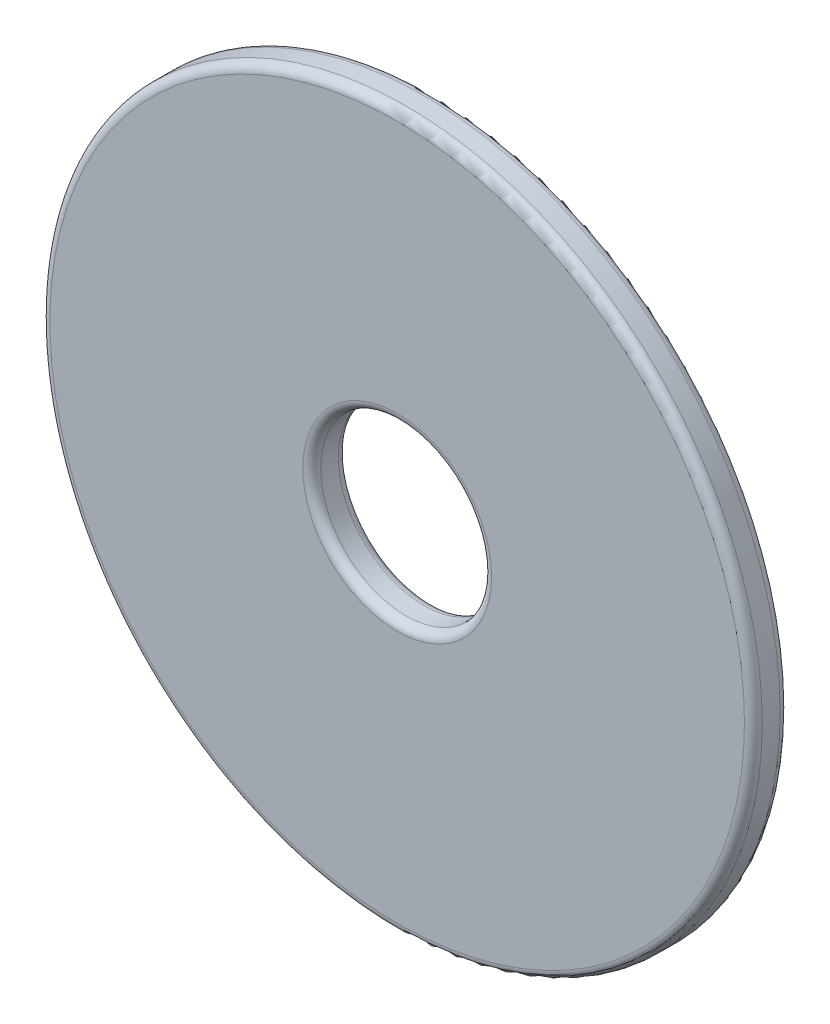
ISO-10303-21;
HEADER;
FILE_DESCRIPTION(('STEP AP214'),'2;1');
FILE_NAME('part.step','',(''),(''),'','','');
FILE_SCHEMA(('AUTOMOTIVE_DESIGN { 1 0 10303 214 1 1 1 1 }'));
ENDSEC;
DATA;
#1=APPLICATION_CONTEXT('core data for automotive mechanical design processes');
#2=APPLICATION_PROTOCOL_DEFINITION('international standard','automotive_design',2000,#1);
#3=PRODUCT_CONTEXT('',#1,'mechanical');
#4=PRODUCT('Part','Part','',(#3));
#5=PRODUCT_RELATED_PRODUCT_CATEGORY('part','',(#4));
#6=PRODUCT_DEFINITION_FORMATION('','',#4);
#7=PRODUCT_DEFINITION_CONTEXT('part definition',#1,'design');
#8=PRODUCT_DEFINITION('design','',#6,#7);
#9=PRODUCT_DEFINITION_SHAPE('','',#8);
#10=(LENGTH_UNIT() NAMED_UNIT(*) SI_UNIT(.MILLI.,.METRE.));
#11=(NAMED_UNIT(*) PLANE_ANGLE_UNIT() SI_UNIT($,.RADIAN.));
#12=(NAMED_UNIT(*) SI_UNIT($,.STERADIAN.) SOLID_ANGLE_UNIT());
#13=UNCERTAINTY_MEASURE_WITH_UNIT(LENGTH_MEASURE(1.E-05),#10,'distance_accuracy_value','');
#14=(GEOMETRIC_REPRESENTATION_CONTEXT(3) GLOBAL_UNCERTAINTY_ASSIGNED_CONTEXT((#13)) GLOBAL_UNIT_ASSIGNED_CONTEXT((#10,
#11,#12)) REPRESENTATION_CONTEXT('',''));
#15=CARTESIAN_POINT('',(0.,0.,0.));
#16=DIRECTION('',(0.,0.,1.));
#17=DIRECTION('',(1.,0.,0.));
#18=AXIS2_PLACEMENT_3D('',#15,#16,#17);
#19=CARTESIAN_POINT('',(0.,0.,1.5875));
#20=DIRECTION('',(0.,0.,1.));
#21=DIRECTION('',(1.,0.,0.));
#22=AXIS2_PLACEMENT_3D('',#19,#20,#21);
#23=PLANE('',#22);
#24=CARTESIAN_POINT('',(0.,0.,1.5875));
#25=DIRECTION('',(0.,0.,1.));
#26=DIRECTION('',(1.,0.,0.));
#27=AXIS2_PLACEMENT_3D('',#24,#25,#26);
#28=CIRCLE('',#27,4.206875);
#29=CARTESIAN_POINT('',(4.206875,0.,1.5875));
#30=VERTEX_POINT('',#29);
#31=EDGE_CURVE('E10',#30,#30,#28,.F.);
#32=ORIENTED_EDGE('',*,*,#31,.T.);
#33=EDGE_LOOP('',(#32));
#34=FACE_BOUND('',#33,.T.);
#35=CARTESIAN_POINT('',(0.,0.,1.5875));
#36=DIRECTION('',(0.,0.,1.));
#37=DIRECTION('',(1.,0.,0.));
#38=AXIS2_PLACEMENT_3D('',#35,#36,#37);
#39=CIRCLE('',#38,15.478125);
#40=CARTESIAN_POINT('',(15.478125,0.,1.5875));
#41=VERTEX_POINT('',#40);
#42=EDGE_CURVE('E45',#41,#41,#39,.T.);
#43=ORIENTED_EDGE('',*,*,#42,.T.);
#44=EDGE_LOOP('',(#43));
#45=FACE_BOUND('',#44,.T.);
#46=ADVANCED_FACE('F37',(#34,#45),#23,.T.);
#47=CARTESIAN_POINT('',(0.,0.,0.));
#48=DIRECTION('',(0.,0.,1.));
#49=DIRECTION('',(1.,0.,0.));
#50=AXIS2_PLACEMENT_3D('',#47,#48,#49);
#51=PLANE('',#50);
#52=CARTESIAN_POINT('',(0.,0.,0.));
#53=DIRECTION('',(0.,0.,1.));
#54=DIRECTION('',(1.,0.,0.));
#55=AXIS2_PLACEMENT_3D('',#52,#53,#54);
#56=CIRCLE('',#55,4.206875);
#57=CARTESIAN_POINT('',(4.206875,0.,0.));
#58=VERTEX_POINT('',#57);
#59=EDGE_CURVE('E69',#58,#58,#56,.T.);
#60=ORIENTED_EDGE('',*,*,#59,.T.);
#61=EDGE_LOOP('',(#60));
#62=FACE_BOUND('',#61,.T.);
#63=CARTESIAN_POINT('',(0.,0.,0.));
#64=DIRECTION('',(0.,0.,1.));
#65=DIRECTION('',(1.,0.,0.));
#66=AXIS2_PLACEMENT_3D('',#63,#64,#65);
#67=CIRCLE('',#66,15.478125);
#68=CARTESIAN_POINT('',(15.478125,0.,0.));
#69=VERTEX_POINT('',#68);
#70=EDGE_CURVE('E73',#69,#69,#67,.F.);
#71=ORIENTED_EDGE('',*,*,#70,.T.);
#72=EDGE_LOOP('',(#71));
#73=FACE_BOUND('',#72,.T.);
#74=ADVANCED_FACE('F78',(#62,#73),#51,.F.);
#75=CARTESIAN_POINT('',(0.,0.,1.5875));
#76=DIRECTION('',(0.,0.,-1.));
#77=DIRECTION('',(-1.,0.,0.));
#78=AXIS2_PLACEMENT_3D('',#75,#76,#77);
#79=CYLINDRICAL_SURFACE('',#78,15.875);
#80=CARTESIAN_POINT('',(0.,0.,0.396875));
#81=DIRECTION('',(0.,0.,1.));
#82=DIRECTION('',(1.,0.,0.));
#83=AXIS2_PLACEMENT_3D('',#80,#81,#82);
#84=CIRCLE('',#83,15.875);
#85=CARTESIAN_POINT('',(15.875,0.,0.396875));
#86=VERTEX_POINT('',#85);
#87=EDGE_CURVE('E50',#86,#86,#84,.T.);
#88=ORIENTED_EDGE('',*,*,#87,.T.);
#89=EDGE_LOOP('',(#88));
#90=FACE_BOUND('',#89,.T.);
#91=CARTESIAN_POINT('',(0.,0.,1.190625));
#92=DIRECTION('',(0.,0.,1.));
#93=DIRECTION('',(1.,0.,0.));
#94=AXIS2_PLACEMENT_3D('',#91,#92,#93);
#95=CIRCLE('',#94,15.875);
#96=CARTESIAN_POINT('',(15.875,0.,1.190625));
#97=VERTEX_POINT('',#96);
#98=EDGE_CURVE('E55',#97,#97,#95,.F.);
#99=ORIENTED_EDGE('',*,*,#98,.T.);
#100=EDGE_LOOP('',(#99));
#101=FACE_BOUND('',#100,.T.);
#102=ADVANCED_FACE('F88',(#90,#101),#79,.T.);
#103=CARTESIAN_POINT('',(0.,0.,1.5875));
#104=DIRECTION('',(0.,0.,-1.));
#105=DIRECTION('',(-1.,0.,0.));
#106=AXIS2_PLACEMENT_3D('',#103,#104,#105);
#107=CYLINDRICAL_SURFACE('',#106,3.81);
#108=CARTESIAN_POINT('',(0.,0.,0.396875));
#109=DIRECTION('',(0.,0.,1.));
#110=DIRECTION('',(1.,0.,0.));
#111=AXIS2_PLACEMENT_3D('',#108,#109,#110);
#112=CIRCLE('',#111,3.81);
#113=CARTESIAN_POINT('',(3.81,0.,0.396875));
#114=VERTEX_POINT('',#113);
#115=EDGE_CURVE('E61',#114,#114,#112,.F.);
#116=ORIENTED_EDGE('',*,*,#115,.T.);
#117=EDGE_LOOP('',(#116));
#118=FACE_BOUND('',#117,.T.);
#119=CARTESIAN_POINT('',(0.,0.,1.190625));
#120=DIRECTION('',(0.,0.,1.));
#121=DIRECTION('',(1.,0.,0.));
#122=AXIS2_PLACEMENT_3D('',#119,#120,#121);
#123=CIRCLE('',#122,3.81);
#124=CARTESIAN_POINT('',(3.81,0.,1.190625));
#125=VERTEX_POINT('',#124);
#126=EDGE_CURVE('E65',#125,#125,#123,.T.);
#127=ORIENTED_EDGE('',*,*,#126,.T.);
#128=EDGE_LOOP('',(#127));
#129=FACE_BOUND('',#128,.T.);
#130=ADVANCED_FACE('F91',(#118,#129),#107,.F.);
#131=CARTESIAN_POINT('',(0.,0.,0.396875));
#132=DIRECTION('',(0.,0.,1.));
#133=DIRECTION('',(1.,0.,0.));
#134=AXIS2_PLACEMENT_3D('',#131,#132,#133);
#135=TOROIDAL_SURFACE('',#134,4.206875,0.396875);
#136=ORIENTED_EDGE('',*,*,#115,.F.);
#137=EDGE_LOOP('',(#136));
#138=FACE_BOUND('',#137,.T.);
#139=ORIENTED_EDGE('',*,*,#59,.F.);
#140=EDGE_LOOP('',(#139));
#141=FACE_BOUND('',#140,.T.);
#142=ADVANCED_FACE('F84',(#138,#141),#135,.T.);
#143=CARTESIAN_POINT('',(0.,0.,0.396875));
#144=DIRECTION('',(0.,0.,1.));
#145=DIRECTION('',(1.,0.,0.));
#146=AXIS2_PLACEMENT_3D('',#143,#144,#145);
#147=TOROIDAL_SURFACE('',#146,15.478125,0.396875);
#148=ORIENTED_EDGE('',*,*,#70,.F.);
#149=EDGE_LOOP('',(#148));
#150=FACE_BOUND('',#149,.T.);
#151=ORIENTED_EDGE('',*,*,#87,.F.);
#152=EDGE_LOOP('',(#151));
#153=FACE_BOUND('',#152,.T.);
#154=ADVANCED_FACE('F80',(#150,#153),#147,.T.);
#155=CARTESIAN_POINT('',(0.,0.,1.190625));
#156=DIRECTION('',(0.,0.,1.));
#157=DIRECTION('',(1.,0.,0.));
#158=AXIS2_PLACEMENT_3D('',#155,#156,#157);
#159=TOROIDAL_SURFACE('',#158,4.206875,0.396875);
#160=ORIENTED_EDGE('',*,*,#31,.F.);
#161=EDGE_LOOP('',(#160));
#162=FACE_BOUND('',#161,.T.);
#163=ORIENTED_EDGE('',*,*,#126,.F.);
#164=EDGE_LOOP('',(#163));
#165=FACE_BOUND('',#164,.T.);
#166=ADVANCED_FACE('F83',(#162,#165),#159,.T.);
#167=CARTESIAN_POINT('',(0.,0.,1.190625));
#168=DIRECTION('',(0.,0.,1.));
#169=DIRECTION('',(1.,0.,0.));
#170=AXIS2_PLACEMENT_3D('',#167,#168,#169);
#171=TOROIDAL_SURFACE('',#170,15.478125,0.396875);
#172=ORIENTED_EDGE('',*,*,#98,.F.);
#173=EDGE_LOOP('',(#172));
#174=FACE_BOUND('',#173,.T.);
#175=ORIENTED_EDGE('',*,*,#42,.F.);
#176=EDGE_LOOP('',(#175));
#177=FACE_BOUND('',#176,.T.);
#178=ADVANCED_FACE('F39',(#174,#177),#171,.T.);
#179=CLOSED_SHELL('',(#46,#74,#102,#130,#142,#154,#166,#178));
#180=MANIFOLD_SOLID_BREP('B2',#179);
#181=ADVANCED_BREP_SHAPE_REPRESENTATION('',(#18,#180),#14);
#182=SHAPE_DEFINITION_REPRESENTATION(#9,#181);
ENDSEC;
END-ISO-10303-21;
